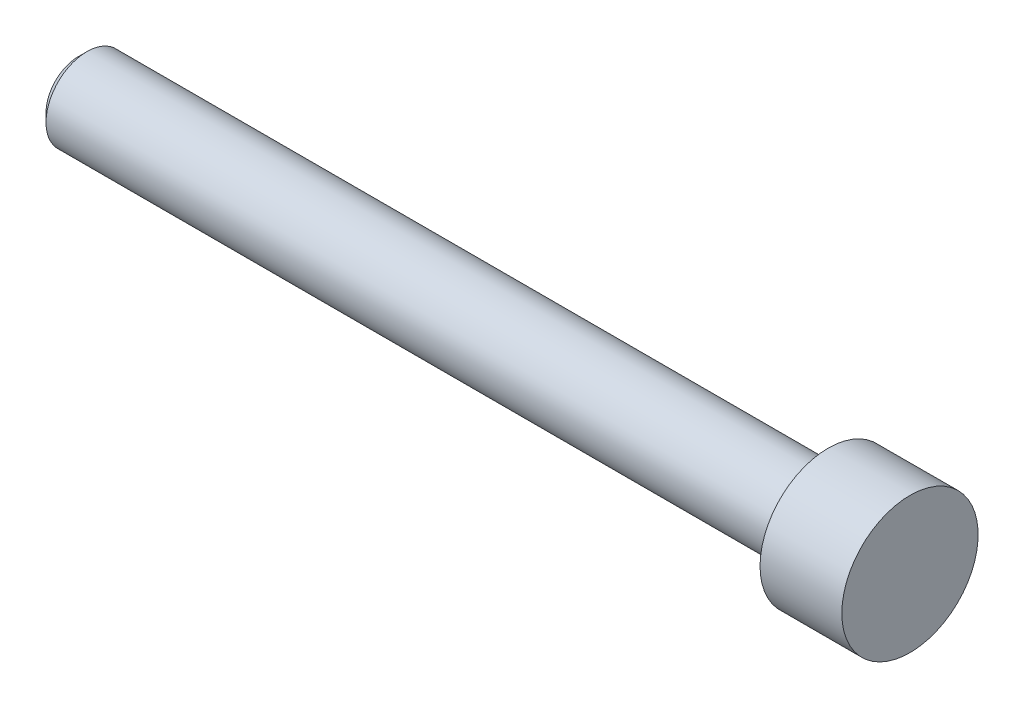
ISO-10303-21;
HEADER;
FILE_DESCRIPTION(('STEP AP214'),'2;1');
FILE_NAME('part.step','',(''),(''),'','','');
FILE_SCHEMA(('AUTOMOTIVE_DESIGN { 1 0 10303 214 1 1 1 1 }'));
ENDSEC;
DATA;
#1=APPLICATION_CONTEXT('core data for automotive mechanical design processes');
#2=APPLICATION_PROTOCOL_DEFINITION('international standard','automotive_design',2000,#1);
#3=PRODUCT_CONTEXT('',#1,'mechanical');
#4=PRODUCT('Part','Part','',(#3));
#5=PRODUCT_RELATED_PRODUCT_CATEGORY('part','',(#4));
#6=PRODUCT_DEFINITION_FORMATION('','',#4);
#7=PRODUCT_DEFINITION_CONTEXT('part definition',#1,'design');
#8=PRODUCT_DEFINITION('design','',#6,#7);
#9=PRODUCT_DEFINITION_SHAPE('','',#8);
#10=(LENGTH_UNIT() NAMED_UNIT(*) SI_UNIT(.MILLI.,.METRE.));
#11=(NAMED_UNIT(*) PLANE_ANGLE_UNIT() SI_UNIT($,.RADIAN.));
#12=(NAMED_UNIT(*) SI_UNIT($,.STERADIAN.) SOLID_ANGLE_UNIT());
#13=UNCERTAINTY_MEASURE_WITH_UNIT(LENGTH_MEASURE(1.E-05),#10,'distance_accuracy_value','');
#14=(GEOMETRIC_REPRESENTATION_CONTEXT(3) GLOBAL_UNCERTAINTY_ASSIGNED_CONTEXT((#13)) GLOBAL_UNIT_ASSIGNED_CONTEXT((#10,
#11,#12)) REPRESENTATION_CONTEXT('',''));
#15=CARTESIAN_POINT('',(0.,0.,0.));
#16=DIRECTION('',(0.,0.,1.));
#17=DIRECTION('',(1.,0.,0.));
#18=AXIS2_PLACEMENT_3D('',#15,#16,#17);
#19=CARTESIAN_POINT('',(-32.5,-2.3865,2.3865));
#20=DIRECTION('',(-1.,0.,0.));
#21=DIRECTION('',(0.,1.,0.));
#22=AXIS2_PLACEMENT_3D('',#19,#20,#21);
#23=PLANE('',#22);
#24=CARTESIAN_POINT('',(-32.5,0.,0.));
#25=DIRECTION('',(-1.,0.,0.));
#26=DIRECTION('',(0.,0.,-1.));
#27=AXIS2_PLACEMENT_3D('',#24,#25,#26);
#28=CIRCLE('',#27,2.3865);
#29=CARTESIAN_POINT('',(-32.5,0.,-2.3865));
#30=VERTEX_POINT('',#29);
#31=EDGE_CURVE('E35',#30,#30,#28,.F.);
#32=ORIENTED_EDGE('',*,*,#31,.F.);
#33=EDGE_LOOP('',(#32));
#34=FACE_BOUND('',#33,.T.);
#35=ADVANCED_FACE('F15',(#34),#23,.T.);
#36=CARTESIAN_POINT('',(22.5,-5.,5.));
#37=DIRECTION('',(-1.,0.,0.));
#38=DIRECTION('',(0.,1.,0.));
#39=AXIS2_PLACEMENT_3D('',#36,#37,#38);
#40=PLANE('',#39);
#41=CARTESIAN_POINT('',(22.5,0.,0.));
#42=DIRECTION('',(-1.,0.,0.));
#43=DIRECTION('',(0.,0.,-1.));
#44=AXIS2_PLACEMENT_3D('',#41,#42,#43);
#45=CIRCLE('',#44,5.);
#46=CARTESIAN_POINT('',(22.5,0.,-5.));
#47=VERTEX_POINT('',#46);
#48=EDGE_CURVE('E30',#47,#47,#45,.F.);
#49=ORIENTED_EDGE('',*,*,#48,.F.);
#50=EDGE_LOOP('',(#49));
#51=FACE_BOUND('',#50,.T.);
#52=CARTESIAN_POINT('',(22.5,0.,0.));
#53=DIRECTION('',(1.,0.,0.));
#54=DIRECTION('',(0.,0.,1.));
#55=AXIS2_PLACEMENT_3D('',#52,#53,#54);
#56=CIRCLE('',#55,3.);
#57=CARTESIAN_POINT('',(22.5,0.,3.));
#58=VERTEX_POINT('',#57);
#59=EDGE_CURVE('E26',#58,#58,#56,.T.);
#60=ORIENTED_EDGE('',*,*,#59,.T.);
#61=EDGE_LOOP('',(#60));
#62=FACE_BOUND('',#61,.T.);
#63=ADVANCED_FACE('F42',(#51,#62),#40,.T.);
#64=CARTESIAN_POINT('',(28.5,-4.99999975829996,-5.00000000000001));
#65=DIRECTION('',(1.,0.,0.));
#66=DIRECTION('',(0.,1.,0.));
#67=AXIS2_PLACEMENT_3D('',#64,#65,#66);
#68=PLANE('',#67);
#69=CARTESIAN_POINT('',(28.5,0.,0.));
#70=DIRECTION('',(1.,0.,0.));
#71=DIRECTION('',(0.,-1.41721898572201E-07,0.99999999999999));
#72=AXIS2_PLACEMENT_3D('',#69,#70,#71);
#73=CIRCLE('',#72,5.);
#74=CARTESIAN_POINT('',(28.5,-7.08609492861005E-07,4.99999999999995));
#75=VERTEX_POINT('',#74);
#76=EDGE_CURVE('E22',#75,#75,#73,.T.);
#77=ORIENTED_EDGE('',*,*,#76,.T.);
#78=EDGE_LOOP('',(#77));
#79=FACE_BOUND('',#78,.T.);
#80=ADVANCED_FACE('F48',(#79),#68,.T.);
#81=CARTESIAN_POINT('',(-31.8865,0.,0.));
#82=DIRECTION('',(1.,0.,0.));
#83=DIRECTION('',(0.,0.,1.));
#84=AXIS2_PLACEMENT_3D('',#81,#82,#83);
#85=CONICAL_SURFACE('',#84,3.00000000000001,0.785398163397457);
#86=CARTESIAN_POINT('',(-31.8865,0.,0.));
#87=DIRECTION('',(-1.,0.,0.));
#88=DIRECTION('',(0.,0.,-1.));
#89=AXIS2_PLACEMENT_3D('',#86,#87,#88);
#90=CIRCLE('',#89,3.00000000000001);
#91=CARTESIAN_POINT('',(-31.8865,0.,-3.00000000000001));
#92=VERTEX_POINT('',#91);
#93=EDGE_CURVE('E10',#92,#92,#90,.F.);
#94=ORIENTED_EDGE('',*,*,#93,.F.);
#95=EDGE_LOOP('',(#94));
#96=FACE_BOUND('',#95,.T.);
#97=ORIENTED_EDGE('',*,*,#31,.T.);
#98=EDGE_LOOP('',(#97));
#99=FACE_BOUND('',#98,.T.);
#100=ADVANCED_FACE('F39',(#96,#99),#85,.T.);
#101=CARTESIAN_POINT('',(28.5,0.,0.));
#102=DIRECTION('',(1.,0.,0.));
#103=DIRECTION('',(0.,0.,1.));
#104=AXIS2_PLACEMENT_3D('',#101,#102,#103);
#105=CYLINDRICAL_SURFACE('',#104,3.);
#106=ORIENTED_EDGE('',*,*,#59,.F.);
#107=EDGE_LOOP('',(#106));
#108=FACE_BOUND('',#107,.T.);
#109=ORIENTED_EDGE('',*,*,#93,.T.);
#110=EDGE_LOOP('',(#109));
#111=FACE_BOUND('',#110,.T.);
#112=ADVANCED_FACE('F55',(#108,#111),#105,.T.);
#113=CARTESIAN_POINT('',(28.5,0.,0.));
#114=DIRECTION('',(1.,0.,0.));
#115=DIRECTION('',(0.,0.,1.));
#116=AXIS2_PLACEMENT_3D('',#113,#114,#115);
#117=CYLINDRICAL_SURFACE('',#116,5.);
#118=ORIENTED_EDGE('',*,*,#76,.F.);
#119=EDGE_LOOP('',(#118));
#120=FACE_BOUND('',#119,.T.);
#121=ORIENTED_EDGE('',*,*,#48,.T.);
#122=EDGE_LOOP('',(#121));
#123=FACE_BOUND('',#122,.T.);
#124=ADVANCED_FACE('F17',(#120,#123),#117,.T.);
#125=CLOSED_SHELL('',(#35,#63,#80,#100,#112,#124));
#126=MANIFOLD_SOLID_BREP('B1',#125);
#127=ADVANCED_BREP_SHAPE_REPRESENTATION('',(#18,#126),#14);
#128=SHAPE_DEFINITION_REPRESENTATION(#9,#127);
ENDSEC;
END-ISO-10303-21;
